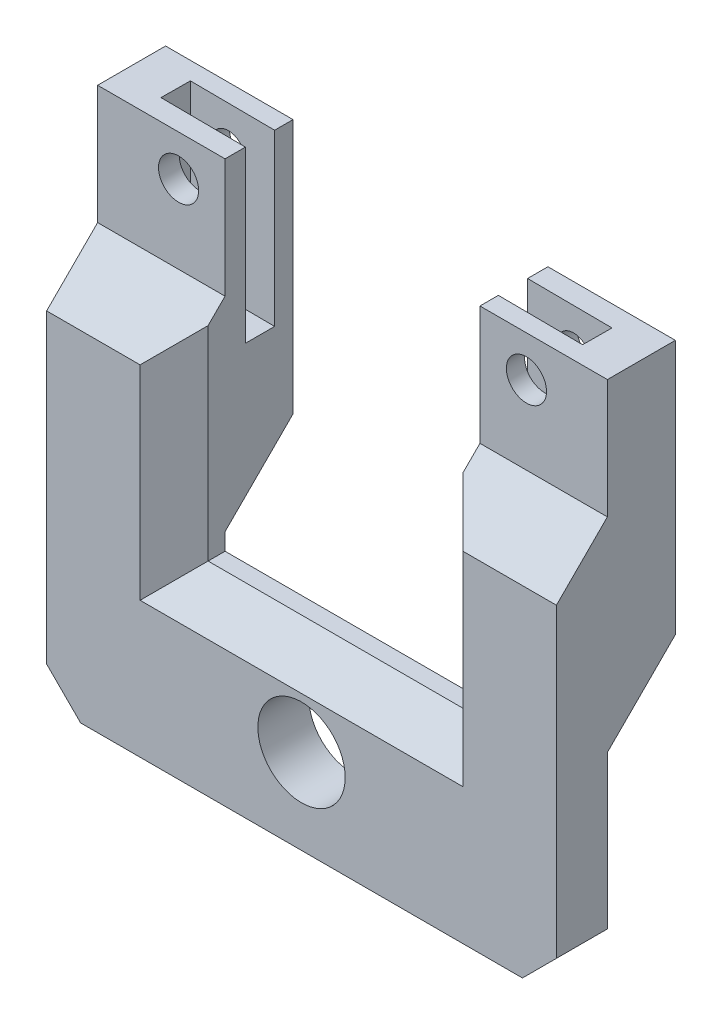
ISO-10303-21;
HEADER;
FILE_DESCRIPTION(('STEP AP214'),'2;1');
FILE_NAME('part.step','',(''),(''),'','','');
FILE_SCHEMA(('AUTOMOTIVE_DESIGN { 1 0 10303 214 1 1 1 1 }'));
ENDSEC;
DATA;
#1=APPLICATION_CONTEXT('core data for automotive mechanical design processes');
#2=APPLICATION_PROTOCOL_DEFINITION('international standard','automotive_design',2000,#1);
#3=PRODUCT_CONTEXT('',#1,'mechanical');
#4=PRODUCT('Part','Part','',(#3));
#5=PRODUCT_RELATED_PRODUCT_CATEGORY('part','',(#4));
#6=PRODUCT_DEFINITION_FORMATION('','',#4);
#7=PRODUCT_DEFINITION_CONTEXT('part definition',#1,'design');
#8=PRODUCT_DEFINITION('design','',#6,#7);
#9=PRODUCT_DEFINITION_SHAPE('','',#8);
#10=(LENGTH_UNIT() NAMED_UNIT(*) SI_UNIT(.MILLI.,.METRE.));
#11=(NAMED_UNIT(*) PLANE_ANGLE_UNIT() SI_UNIT($,.RADIAN.));
#12=(NAMED_UNIT(*) SI_UNIT($,.STERADIAN.) SOLID_ANGLE_UNIT());
#13=UNCERTAINTY_MEASURE_WITH_UNIT(LENGTH_MEASURE(1.E-05),#10,'distance_accuracy_value','');
#14=(GEOMETRIC_REPRESENTATION_CONTEXT(3) GLOBAL_UNCERTAINTY_ASSIGNED_CONTEXT((#13)) GLOBAL_UNIT_ASSIGNED_CONTEXT((#10,
#11,#12)) REPRESENTATION_CONTEXT('',''));
#15=CARTESIAN_POINT('',(0.,0.,0.));
#16=DIRECTION('',(0.,0.,1.));
#17=DIRECTION('',(1.,0.,0.));
#18=AXIS2_PLACEMENT_3D('',#15,#16,#17);
#19=CARTESIAN_POINT('',(0.,0.,-8.89));
#20=DIRECTION('',(0.,0.,1.));
#21=DIRECTION('',(1.,0.,0.));
#22=AXIS2_PLACEMENT_3D('',#19,#20,#21);
#23=PLANE('',#22);
#24=CARTESIAN_POINT('',(13.,16.002,-8.89));
#25=DIRECTION('',(0.,0.,1.));
#26=DIRECTION('',(-1.,0.,0.));
#27=AXIS2_PLACEMENT_3D('',#24,#25,#26);
#28=CIRCLE('',#27,1.27);
#29=CARTESIAN_POINT('',(11.73,16.002,-8.89));
#30=VERTEX_POINT('',#29);
#31=EDGE_CURVE('E392',#30,#30,#28,.T.);
#32=ORIENTED_EDGE('',*,*,#31,.T.);
#33=EDGE_LOOP('',(#32));
#34=FACE_BOUND('',#33,.T.);
#35=DIRECTION('',(0.,1.,0.));
#36=VECTOR('',#35,1.);
#37=CARTESIAN_POINT('',(19.05,19.05,-8.89));
#38=LINE('',#37,#36);
#39=CARTESIAN_POINT('',(19.05,0.,-8.89));
#40=VERTEX_POINT('',#39);
#41=CARTESIAN_POINT('',(19.05,19.05,-8.89));
#42=VERTEX_POINT('',#41);
#43=EDGE_CURVE('E330',#40,#42,#38,.T.);
#44=ORIENTED_EDGE('',*,*,#43,.F.);
#45=DIRECTION('',(1.,0.,0.));
#46=VECTOR('',#45,1.);
#47=CARTESIAN_POINT('',(19.05,0.,-8.89));
#48=LINE('',#47,#46);
#49=CARTESIAN_POINT('',(9.525,0.,-8.89));
#50=VERTEX_POINT('',#49);
#51=EDGE_CURVE('E232',#50,#40,#48,.T.);
#52=ORIENTED_EDGE('',*,*,#51,.F.);
#53=DIRECTION('',(0.,1.,0.));
#54=VECTOR('',#53,1.);
#55=CARTESIAN_POINT('',(9.525,-6.35,-8.89));
#56=LINE('',#55,#54);
#57=CARTESIAN_POINT('',(9.525,19.05,-8.89));
#58=VERTEX_POINT('',#57);
#59=EDGE_CURVE('E382',#50,#58,#56,.T.);
#60=ORIENTED_EDGE('',*,*,#59,.T.);
#61=DIRECTION('',(-1.,0.,0.));
#62=VECTOR('',#61,1.);
#63=CARTESIAN_POINT('',(-19.05,19.05,-8.89));
#64=LINE('',#63,#62);
#65=EDGE_CURVE('E245',#42,#58,#64,.T.);
#66=ORIENTED_EDGE('',*,*,#65,.F.);
#67=EDGE_LOOP('',(#44,#52,#60,#66));
#68=FACE_BOUND('',#67,.T.);
#69=ADVANCED_FACE('F35',(#34,#68),#23,.F.);
#70=CARTESIAN_POINT('',(-19.05,19.05,-8.89));
#71=DIRECTION('',(0.,1.,0.));
#72=DIRECTION('',(0.,0.,1.));
#73=AXIS2_PLACEMENT_3D('',#70,#71,#72);
#74=PLANE('',#73);
#75=DIRECTION('',(0.999971891836352,0.,0.00749770212982274));
#76=VECTOR('',#75,1.);
#77=CARTESIAN_POINT('',(15.8663647926359,19.05,-5.1388046784254));
#78=LINE('',#77,#76);
#79=CARTESIAN_POINT('',(9.525,19.05,-5.18635167919601));
#80=VERTEX_POINT('',#79);
#81=CARTESIAN_POINT('',(15.8663647926359,19.05,-5.1388046784254));
#82=VERTEX_POINT('',#81);
#83=EDGE_CURVE('E433',#80,#82,#78,.T.);
#84=ORIENTED_EDGE('',*,*,#83,.F.);
#85=DIRECTION('',(0.,0.,-1.));
#86=VECTOR('',#85,1.);
#87=CARTESIAN_POINT('',(9.525,19.05,-8.89));
#88=LINE('',#87,#86);
#89=CARTESIAN_POINT('',(9.525,19.05,-3.81));
#90=VERTEX_POINT('',#89);
#91=EDGE_CURVE('E389',#90,#80,#88,.T.);
#92=ORIENTED_EDGE('',*,*,#91,.F.);
#93=DIRECTION('',(-1.,0.,0.));
#94=VECTOR('',#93,1.);
#95=CARTESIAN_POINT('',(-19.05,19.05,-3.81));
#96=LINE('',#95,#94);
#97=CARTESIAN_POINT('',(19.05,19.05,-3.81));
#98=VERTEX_POINT('',#97);
#99=EDGE_CURVE('E406',#98,#90,#96,.T.);
#100=ORIENTED_EDGE('',*,*,#99,.F.);
#101=DIRECTION('',(0.,0.,1.));
#102=VECTOR('',#101,1.);
#103=CARTESIAN_POINT('',(19.05,19.05,-8.89));
#104=LINE('',#103,#102);
#105=EDGE_CURVE('E244',#42,#98,#104,.T.);
#106=ORIENTED_EDGE('',*,*,#105,.F.);
#107=ORIENTED_EDGE('',*,*,#65,.T.);
#108=CARTESIAN_POINT('',(9.525,19.05,-7.37081308039455));
#109=VERTEX_POINT('',#108);
#110=EDGE_CURVE('E388',#109,#58,#88,.T.);
#111=ORIENTED_EDGE('',*,*,#110,.F.);
#112=DIRECTION('',(-0.999971891836352,0.,-0.00749770212982277));
#113=VECTOR('',#112,1.);
#114=CARTESIAN_POINT('',(15.8827427731683,19.05,-7.32314327895272));
#115=LINE('',#114,#113);
#116=CARTESIAN_POINT('',(15.8827427731683,19.05,-7.32314327895272));
#117=VERTEX_POINT('',#116);
#118=EDGE_CURVE('E482',#117,#109,#115,.T.);
#119=ORIENTED_EDGE('',*,*,#118,.F.);
#120=DIRECTION('',(0.00749770212982325,0.,-0.999971891836352));
#121=VECTOR('',#120,1.);
#122=CARTESIAN_POINT('',(15.8827427731683,19.05,-7.32314327895272));
#123=LINE('',#122,#121);
#124=EDGE_CURVE('E459',#82,#117,#123,.T.);
#125=ORIENTED_EDGE('',*,*,#124,.F.);
#126=EDGE_LOOP('',(#84,#92,#100,#106,#107,#111,#119,#125));
#127=FACE_BOUND('',#126,.T.);
#128=ADVANCED_FACE('F430',(#127),#74,.T.);
#129=CARTESIAN_POINT('',(0.,0.,-3.81));
#130=DIRECTION('',(0.,0.,1.));
#131=DIRECTION('',(1.,0.,0.));
#132=AXIS2_PLACEMENT_3D('',#129,#130,#131);
#133=PLANE('',#132);
#134=CARTESIAN_POINT('',(13.,16.002,-3.81));
#135=DIRECTION('',(0.,0.,1.));
#136=DIRECTION('',(-1.,0.,0.));
#137=AXIS2_PLACEMENT_3D('',#134,#135,#136);
#138=CIRCLE('',#137,1.5);
#139=CARTESIAN_POINT('',(11.5,16.002,-3.81));
#140=VERTEX_POINT('',#139);
#141=EDGE_CURVE('E298',#140,#140,#138,.T.);
#142=ORIENTED_EDGE('',*,*,#141,.F.);
#143=EDGE_LOOP('',(#142));
#144=FACE_BOUND('',#143,.T.);
#145=DIRECTION('',(0.,1.,0.));
#146=VECTOR('',#145,1.);
#147=CARTESIAN_POINT('',(9.525,0.,-3.81));
#148=LINE('',#147,#146);
#149=CARTESIAN_POINT('',(9.525,10.16,-3.81));
#150=VERTEX_POINT('',#149);
#151=EDGE_CURVE('E345',#150,#90,#148,.T.);
#152=ORIENTED_EDGE('',*,*,#151,.F.);
#153=DIRECTION('',(1.,0.,0.));
#154=VECTOR('',#153,1.);
#155=CARTESIAN_POINT('',(0.,10.16,-3.81));
#156=LINE('',#155,#154);
#157=CARTESIAN_POINT('',(19.05,10.16,-3.81));
#158=VERTEX_POINT('',#157);
#159=EDGE_CURVE('E262',#150,#158,#156,.T.);
#160=ORIENTED_EDGE('',*,*,#159,.T.);
#161=DIRECTION('',(0.,1.,0.));
#162=VECTOR('',#161,1.);
#163=CARTESIAN_POINT('',(19.05,19.05,-3.81));
#164=LINE('',#163,#162);
#165=EDGE_CURVE('E402',#158,#98,#164,.T.);
#166=ORIENTED_EDGE('',*,*,#165,.T.);
#167=ORIENTED_EDGE('',*,*,#99,.T.);
#168=EDGE_LOOP('',(#152,#160,#166,#167));
#169=FACE_BOUND('',#168,.T.);
#170=ADVANCED_FACE('F426',(#144,#169),#133,.T.);
#171=CARTESIAN_POINT('',(-15.8827427731683,19.05,-5.37685672104727));
#172=VERTEX_POINT('',#171);
#173=CARTESIAN_POINT('',(-9.52500000000001,19.05,-5.32918691960544));
#174=VERTEX_POINT('',#173);
#175=EDGE_CURVE('E469',#172,#174,#78,.T.);
#176=ORIENTED_EDGE('',*,*,#175,.F.);
#177=DIRECTION('',(-0.00749770212982166,0.,0.999971891836352));
#178=VECTOR('',#177,1.);
#179=CARTESIAN_POINT('',(-15.8663647926359,19.05,-7.5611953215746));
#180=LINE('',#179,#178);
#181=CARTESIAN_POINT('',(-15.8663647926359,19.05,-7.5611953215746));
#182=VERTEX_POINT('',#181);
#183=EDGE_CURVE('E484',#182,#172,#180,.T.);
#184=ORIENTED_EDGE('',*,*,#183,.F.);
#185=CARTESIAN_POINT('',(-9.525,19.05,-7.51364832080399));
#186=VERTEX_POINT('',#185);
#187=EDGE_CURVE('E481',#186,#182,#115,.T.);
#188=ORIENTED_EDGE('',*,*,#187,.F.);
#189=DIRECTION('',(0.,0.,1.));
#190=VECTOR('',#189,1.);
#191=CARTESIAN_POINT('',(-9.525,19.05,-8.89));
#192=LINE('',#191,#190);
#193=CARTESIAN_POINT('',(-9.525,19.05,-8.89));
#194=VERTEX_POINT('',#193);
#195=EDGE_CURVE('E385',#194,#186,#192,.T.);
#196=ORIENTED_EDGE('',*,*,#195,.F.);
#197=CARTESIAN_POINT('',(-19.05,19.05,-8.89));
#198=VERTEX_POINT('',#197);
#199=EDGE_CURVE('E333',#194,#198,#64,.T.);
#200=ORIENTED_EDGE('',*,*,#199,.T.);
#201=DIRECTION('',(0.,0.,1.));
#202=VECTOR('',#201,1.);
#203=CARTESIAN_POINT('',(-19.05,19.05,-8.89));
#204=LINE('',#203,#202);
#205=CARTESIAN_POINT('',(-19.05,19.05,-3.81));
#206=VERTEX_POINT('',#205);
#207=EDGE_CURVE('E243',#198,#206,#204,.T.);
#208=ORIENTED_EDGE('',*,*,#207,.T.);
#209=CARTESIAN_POINT('',(-9.525,19.05,-3.81));
#210=VERTEX_POINT('',#209);
#211=EDGE_CURVE('E405',#210,#206,#96,.T.);
#212=ORIENTED_EDGE('',*,*,#211,.F.);
#213=EDGE_CURVE('E380',#174,#210,#192,.T.);
#214=ORIENTED_EDGE('',*,*,#213,.F.);
#215=EDGE_LOOP('',(#176,#184,#188,#196,#200,#208,#212,#214));
#216=FACE_BOUND('',#215,.T.);
#217=ADVANCED_FACE('F550',(#216),#74,.T.);
#218=CARTESIAN_POINT('',(19.05,19.05,-8.89));
#219=DIRECTION('',(1.,0.,0.));
#220=DIRECTION('',(0.,1.,0.));
#221=AXIS2_PLACEMENT_3D('',#218,#219,#220);
#222=PLANE('',#221);
#223=DIRECTION('',(0.,1.,0.));
#224=VECTOR('',#223,1.);
#225=CARTESIAN_POINT('',(19.05,19.05,0.));
#226=LINE('',#225,#224);
#227=CARTESIAN_POINT('',(19.05,-16.51,0.));
#228=VERTEX_POINT('',#227);
#229=CARTESIAN_POINT('',(19.05,6.35,0.));
#230=VERTEX_POINT('',#229);
#231=EDGE_CURVE('E335',#228,#230,#226,.T.);
#232=ORIENTED_EDGE('',*,*,#231,.F.);
#233=DIRECTION('',(0.,0.,-1.));
#234=VECTOR('',#233,1.);
#235=CARTESIAN_POINT('',(19.05,-16.51,-8.89));
#236=LINE('',#235,#234);
#237=CARTESIAN_POINT('',(19.05,-16.51,-3.81));
#238=VERTEX_POINT('',#237);
#239=EDGE_CURVE('E44',#228,#238,#236,.T.);
#240=ORIENTED_EDGE('',*,*,#239,.T.);
#241=DIRECTION('',(0.,-1.,0.));
#242=VECTOR('',#241,1.);
#243=CARTESIAN_POINT('',(19.05,-19.05,-3.81));
#244=LINE('',#243,#242);
#245=CARTESIAN_POINT('',(19.05,-5.08000000000004,-3.81));
#246=VERTEX_POINT('',#245);
#247=EDGE_CURVE('E231',#246,#238,#244,.T.);
#248=ORIENTED_EDGE('',*,*,#247,.F.);
#249=DIRECTION('',(0.,-0.707106781186551,0.707106781186544));
#250=VECTOR('',#249,1.);
#251=CARTESIAN_POINT('',(19.05,-5.08000000000003,-3.81));
#252=LINE('',#251,#250);
#253=EDGE_CURVE('E250',#246,#40,#252,.F.);
#254=ORIENTED_EDGE('',*,*,#253,.T.);
#255=ORIENTED_EDGE('',*,*,#43,.T.);
#256=ORIENTED_EDGE('',*,*,#105,.T.);
#257=ORIENTED_EDGE('',*,*,#165,.F.);
#258=DIRECTION('',(0.,-0.707106781186551,0.707106781186544));
#259=VECTOR('',#258,1.);
#260=CARTESIAN_POINT('',(19.05,10.16,-3.81));
#261=LINE('',#260,#259);
#262=EDGE_CURVE('E270',#158,#230,#261,.T.);
#263=ORIENTED_EDGE('',*,*,#262,.T.);
#264=EDGE_LOOP('',(#232,#240,#248,#254,#255,#256,#257,#263));
#265=FACE_BOUND('',#264,.T.);
#266=ADVANCED_FACE('F421',(#265),#222,.T.);
#267=CARTESIAN_POINT('',(-19.05,-19.05,-8.89));
#268=DIRECTION('',(0.,-1.,0.));
#269=DIRECTION('',(0.,0.,-1.));
#270=AXIS2_PLACEMENT_3D('',#267,#268,#269);
#271=PLANE('',#270);
#272=DIRECTION('',(1.,0.,0.));
#273=VECTOR('',#272,1.);
#274=CARTESIAN_POINT('',(-19.05,-19.05,0.));
#275=LINE('',#274,#273);
#276=CARTESIAN_POINT('',(-16.51,-19.05,0.));
#277=VERTEX_POINT('',#276);
#278=CARTESIAN_POINT('',(16.51,-19.05,0.));
#279=VERTEX_POINT('',#278);
#280=EDGE_CURVE('E326',#277,#279,#275,.T.);
#281=ORIENTED_EDGE('',*,*,#280,.F.);
#282=DIRECTION('',(0.,0.,-1.));
#283=VECTOR('',#282,1.);
#284=CARTESIAN_POINT('',(-16.51,-19.05,-8.89));
#285=LINE('',#284,#283);
#286=CARTESIAN_POINT('',(-16.51,-19.05,-1.26999999999999));
#287=VERTEX_POINT('',#286);
#288=EDGE_CURVE('E308',#277,#287,#285,.T.);
#289=ORIENTED_EDGE('',*,*,#288,.T.);
#290=DIRECTION('',(1.,0.,0.));
#291=VECTOR('',#290,1.);
#292=CARTESIAN_POINT('',(19.05,-19.05,-1.26999999999999));
#293=LINE('',#292,#291);
#294=CARTESIAN_POINT('',(16.51,-19.05,-1.26999999999999));
#295=VERTEX_POINT('',#294);
#296=EDGE_CURVE('E59',#287,#295,#293,.T.);
#297=ORIENTED_EDGE('',*,*,#296,.T.);
#298=DIRECTION('',(0.,0.,1.));
#299=VECTOR('',#298,1.);
#300=CARTESIAN_POINT('',(16.51,-19.05,-8.89));
#301=LINE('',#300,#299);
#302=EDGE_CURVE('E306',#295,#279,#301,.T.);
#303=ORIENTED_EDGE('',*,*,#302,.T.);
#304=EDGE_LOOP('',(#281,#289,#297,#303));
#305=FACE_BOUND('',#304,.T.);
#306=ADVANCED_FACE('F325',(#305),#271,.T.);
#307=CARTESIAN_POINT('',(-19.05,19.05,-8.89));
#308=DIRECTION('',(-1.,0.,0.));
#309=DIRECTION('',(0.,-1.,0.));
#310=AXIS2_PLACEMENT_3D('',#307,#308,#309);
#311=PLANE('',#310);
#312=DIRECTION('',(0.,1.,0.));
#313=VECTOR('',#312,1.);
#314=CARTESIAN_POINT('',(-19.05,-19.05,-3.81));
#315=LINE('',#314,#313);
#316=CARTESIAN_POINT('',(-19.05,-16.51,-3.81));
#317=VERTEX_POINT('',#316);
#318=CARTESIAN_POINT('',(-19.05,-5.08000000000004,-3.81));
#319=VERTEX_POINT('',#318);
#320=EDGE_CURVE('E369',#317,#319,#315,.T.);
#321=ORIENTED_EDGE('',*,*,#320,.F.);
#322=DIRECTION('',(0.,0.,1.));
#323=VECTOR('',#322,1.);
#324=CARTESIAN_POINT('',(-19.05,-16.51,-8.89));
#325=LINE('',#324,#323);
#326=CARTESIAN_POINT('',(-19.05,-16.51,0.));
#327=VERTEX_POINT('',#326);
#328=EDGE_CURVE('E292',#317,#327,#325,.T.);
#329=ORIENTED_EDGE('',*,*,#328,.T.);
#330=DIRECTION('',(0.,-1.,0.));
#331=VECTOR('',#330,1.);
#332=CARTESIAN_POINT('',(-19.05,19.05,0.));
#333=LINE('',#332,#331);
#334=CARTESIAN_POINT('',(-19.05,6.35,0.));
#335=VERTEX_POINT('',#334);
#336=EDGE_CURVE('E331',#335,#327,#333,.T.);
#337=ORIENTED_EDGE('',*,*,#336,.F.);
#338=DIRECTION('',(0.,0.707106781186551,-0.707106781186544));
#339=VECTOR('',#338,1.);
#340=CARTESIAN_POINT('',(-19.05,10.16,-3.81));
#341=LINE('',#340,#339);
#342=CARTESIAN_POINT('',(-19.05,10.16,-3.81));
#343=VERTEX_POINT('',#342);
#344=EDGE_CURVE('E268',#335,#343,#341,.T.);
#345=ORIENTED_EDGE('',*,*,#344,.T.);
#346=DIRECTION('',(0.,-1.,0.));
#347=VECTOR('',#346,1.);
#348=CARTESIAN_POINT('',(-19.05,19.05,-3.81));
#349=LINE('',#348,#347);
#350=EDGE_CURVE('E399',#206,#343,#349,.T.);
#351=ORIENTED_EDGE('',*,*,#350,.F.);
#352=ORIENTED_EDGE('',*,*,#207,.F.);
#353=DIRECTION('',(0.,-1.,0.));
#354=VECTOR('',#353,1.);
#355=CARTESIAN_POINT('',(-19.05,19.05,-8.89));
#356=LINE('',#355,#354);
#357=CARTESIAN_POINT('',(-19.05,0.,-8.89));
#358=VERTEX_POINT('',#357);
#359=EDGE_CURVE('E227',#198,#358,#356,.T.);
#360=ORIENTED_EDGE('',*,*,#359,.T.);
#361=DIRECTION('',(0.,0.707106781186551,-0.707106781186544));
#362=VECTOR('',#361,1.);
#363=CARTESIAN_POINT('',(-19.05,-5.08000000000003,-3.81));
#364=LINE('',#363,#362);
#365=EDGE_CURVE('E239',#358,#319,#364,.F.);
#366=ORIENTED_EDGE('',*,*,#365,.T.);
#367=EDGE_LOOP('',(#321,#329,#337,#345,#351,#352,#360,#366));
#368=FACE_BOUND('',#367,.T.);
#369=ADVANCED_FACE('F238',(#368),#311,.T.);
#370=CARTESIAN_POINT('',(-13.,16.002,-8.89));
#371=DIRECTION('',(0.,0.,1.));
#372=DIRECTION('',(1.,0.,0.));
#373=AXIS2_PLACEMENT_3D('',#370,#371,#372);
#374=CIRCLE('',#373,1.27);
#375=CARTESIAN_POINT('',(-11.73,16.002,-8.89));
#376=VERTEX_POINT('',#375);
#377=EDGE_CURVE('E395',#376,#376,#374,.T.);
#378=ORIENTED_EDGE('',*,*,#377,.T.);
#379=EDGE_LOOP('',(#378));
#380=FACE_BOUND('',#379,.T.);
#381=DIRECTION('',(0.,-1.,0.));
#382=VECTOR('',#381,1.);
#383=CARTESIAN_POINT('',(-9.525,-6.35,-8.89));
#384=LINE('',#383,#382);
#385=CARTESIAN_POINT('',(-9.52500000000001,0.,-8.89));
#386=VERTEX_POINT('',#385);
#387=EDGE_CURVE('E228',#194,#386,#384,.T.);
#388=ORIENTED_EDGE('',*,*,#387,.T.);
#389=EDGE_CURVE('E223',#358,#386,#48,.T.);
#390=ORIENTED_EDGE('',*,*,#389,.F.);
#391=ORIENTED_EDGE('',*,*,#359,.F.);
#392=ORIENTED_EDGE('',*,*,#199,.F.);
#393=EDGE_LOOP('',(#388,#390,#391,#392));
#394=FACE_BOUND('',#393,.T.);
#395=ADVANCED_FACE('F225',(#380,#394),#23,.F.);
#396=CARTESIAN_POINT('',(0.,0.,0.));
#397=DIRECTION('',(0.,0.,1.));
#398=DIRECTION('',(1.,0.,0.));
#399=AXIS2_PLACEMENT_3D('',#396,#397,#398);
#400=PLANE('',#399);
#401=CARTESIAN_POINT('',(0.,-12.7,0.));
#402=DIRECTION('',(0.,0.,1.));
#403=DIRECTION('',(1.,0.,0.));
#404=AXIS2_PLACEMENT_3D('',#401,#402,#403);
#405=CIRCLE('',#404,3.2639);
#406=CARTESIAN_POINT('',(3.2639,-12.7,0.));
#407=VERTEX_POINT('',#406);
#408=EDGE_CURVE('E363',#407,#407,#405,.T.);
#409=ORIENTED_EDGE('',*,*,#408,.F.);
#410=EDGE_LOOP('',(#409));
#411=FACE_BOUND('',#410,.T.);
#412=ORIENTED_EDGE('',*,*,#336,.T.);
#413=DIRECTION('',(-0.707106781186549,0.707106781186546,0.));
#414=VECTOR('',#413,1.);
#415=CARTESIAN_POINT('',(-17.78,-17.78,0.));
#416=LINE('',#415,#414);
#417=EDGE_CURVE('E303',#327,#277,#416,.F.);
#418=ORIENTED_EDGE('',*,*,#417,.T.);
#419=ORIENTED_EDGE('',*,*,#280,.T.);
#420=DIRECTION('',(-0.707106781186549,-0.707106781186546,0.));
#421=VECTOR('',#420,1.);
#422=CARTESIAN_POINT('',(17.78,-17.78,0.));
#423=LINE('',#422,#421);
#424=EDGE_CURVE('E301',#279,#228,#423,.F.);
#425=ORIENTED_EDGE('',*,*,#424,.T.);
#426=ORIENTED_EDGE('',*,*,#231,.T.);
#427=DIRECTION('',(1.,0.,0.));
#428=VECTOR('',#427,1.);
#429=CARTESIAN_POINT('',(-19.05,6.35,0.));
#430=LINE('',#429,#428);
#431=CARTESIAN_POINT('',(12.065,6.35,0.));
#432=VERTEX_POINT('',#431);
#433=EDGE_CURVE('E398',#432,#230,#430,.T.);
#434=ORIENTED_EDGE('',*,*,#433,.F.);
#435=DIRECTION('',(0.,-1.,0.));
#436=VECTOR('',#435,1.);
#437=CARTESIAN_POINT('',(12.065,-6.35,0.));
#438=LINE('',#437,#436);
#439=CARTESIAN_POINT('',(12.065,-8.89000000000001,0.));
#440=VERTEX_POINT('',#439);
#441=EDGE_CURVE('E278',#432,#440,#438,.T.);
#442=ORIENTED_EDGE('',*,*,#441,.T.);
#443=DIRECTION('',(-1.,0.,0.));
#444=VECTOR('',#443,1.);
#445=CARTESIAN_POINT('',(-9.525,-8.89000000000001,0.));
#446=LINE('',#445,#444);
#447=CARTESIAN_POINT('',(-12.065,-8.89000000000001,0.));
#448=VERTEX_POINT('',#447);
#449=EDGE_CURVE('E280',#440,#448,#446,.T.);
#450=ORIENTED_EDGE('',*,*,#449,.T.);
#451=DIRECTION('',(0.,1.,0.));
#452=VECTOR('',#451,1.);
#453=CARTESIAN_POINT('',(-12.065,6.35,0.));
#454=LINE('',#453,#452);
#455=CARTESIAN_POINT('',(-12.065,6.35,0.));
#456=VERTEX_POINT('',#455);
#457=EDGE_CURVE('E282',#448,#456,#454,.T.);
#458=ORIENTED_EDGE('',*,*,#457,.T.);
#459=EDGE_CURVE('E403',#335,#456,#430,.T.);
#460=ORIENTED_EDGE('',*,*,#459,.F.);
#461=EDGE_LOOP('',(#412,#418,#419,#425,#426,#434,#442,#450,#458,#460));
#462=FACE_BOUND('',#461,.T.);
#463=ADVANCED_FACE('F329',(#411,#462),#400,.T.);
#464=CARTESIAN_POINT('',(-13.,16.002,-3.81));
#465=DIRECTION('',(0.,0.,1.));
#466=DIRECTION('',(1.,0.,0.));
#467=AXIS2_PLACEMENT_3D('',#464,#465,#466);
#468=CIRCLE('',#467,1.5);
#469=CARTESIAN_POINT('',(-11.5,16.002,-3.81));
#470=VERTEX_POINT('',#469);
#471=EDGE_CURVE('E603',#470,#470,#468,.T.);
#472=ORIENTED_EDGE('',*,*,#471,.F.);
#473=EDGE_LOOP('',(#472));
#474=FACE_BOUND('',#473,.T.);
#475=ORIENTED_EDGE('',*,*,#350,.T.);
#476=DIRECTION('',(1.,0.,0.));
#477=VECTOR('',#476,1.);
#478=CARTESIAN_POINT('',(0.,10.16,-3.81));
#479=LINE('',#478,#477);
#480=CARTESIAN_POINT('',(-9.525,10.16,-3.81));
#481=VERTEX_POINT('',#480);
#482=EDGE_CURVE('E259',#343,#481,#479,.T.);
#483=ORIENTED_EDGE('',*,*,#482,.T.);
#484=DIRECTION('',(0.,-1.,0.));
#485=VECTOR('',#484,1.);
#486=CARTESIAN_POINT('',(-9.525,0.,-3.81));
#487=LINE('',#486,#485);
#488=EDGE_CURVE('E340',#210,#481,#487,.T.);
#489=ORIENTED_EDGE('',*,*,#488,.F.);
#490=ORIENTED_EDGE('',*,*,#211,.T.);
#491=EDGE_LOOP('',(#475,#483,#489,#490));
#492=FACE_BOUND('',#491,.T.);
#493=ADVANCED_FACE('F559',(#474,#492),#133,.T.);
#494=CARTESIAN_POINT('',(-13.,16.002,-8.89));
#495=DIRECTION('',(0.,0.,1.));
#496=DIRECTION('',(1.,0.,0.));
#497=AXIS2_PLACEMENT_3D('',#494,#495,#496);
#498=CYLINDRICAL_SURFACE('',#497,1.27);
#499=CARTESIAN_POINT('',(-13.,16.002,-7.53970356807028));
#500=DIRECTION('',(0.00749770212982277,0.,-0.999971891836352));
#501=DIRECTION('',(0.999971891836352,0.,0.00749770212982277));
#502=AXIS2_PLACEMENT_3D('',#499,#500,#501);
#503=ELLIPSE('',#502,1.27003569837125,1.27);
#504=CARTESIAN_POINT('',(-11.73,16.002,-7.53018121870965));
#505=VERTEX_POINT('',#504);
#506=EDGE_CURVE('E505',#505,#505,#503,.F.);
#507=ORIENTED_EDGE('',*,*,#506,.T.);
#508=EDGE_LOOP('',(#507));
#509=FACE_BOUND('',#508,.T.);
#510=ORIENTED_EDGE('',*,*,#377,.F.);
#511=EDGE_LOOP('',(#510));
#512=FACE_BOUND('',#511,.T.);
#513=ADVANCED_FACE('F564',(#509,#512),#498,.F.);
#514=CARTESIAN_POINT('',(13.,16.002,-8.89));
#515=DIRECTION('',(0.,0.,1.));
#516=DIRECTION('',(1.,0.,0.));
#517=AXIS2_PLACEMENT_3D('',#514,#515,#516);
#518=CYLINDRICAL_SURFACE('',#517,1.27);
#519=CARTESIAN_POINT('',(13.,16.002,-7.34475783312827));
#520=DIRECTION('',(0.00749770212982277,0.,-0.999971891836352));
#521=DIRECTION('',(0.999971891836352,0.,0.00749770212982277));
#522=AXIS2_PLACEMENT_3D('',#519,#520,#521);
#523=ELLIPSE('',#522,1.27003569837125,1.27);
#524=CARTESIAN_POINT('',(14.27,16.002,-7.33523548376764));
#525=VERTEX_POINT('',#524);
#526=EDGE_CURVE('E502',#525,#525,#523,.F.);
#527=ORIENTED_EDGE('',*,*,#526,.T.);
#528=EDGE_LOOP('',(#527));
#529=FACE_BOUND('',#528,.T.);
#530=ORIENTED_EDGE('',*,*,#31,.F.);
#531=EDGE_LOOP('',(#530));
#532=FACE_BOUND('',#531,.T.);
#533=ADVANCED_FACE('F566',(#529,#532),#518,.F.);
#534=CARTESIAN_POINT('',(9.525,-6.35,-8.89));
#535=DIRECTION('',(1.,0.,0.));
#536=DIRECTION('',(0.,0.,-1.));
#537=AXIS2_PLACEMENT_3D('',#534,#535,#536);
#538=PLANE('',#537);
#539=DIRECTION('',(0.,0.,1.));
#540=VECTOR('',#539,1.);
#541=CARTESIAN_POINT('',(9.525,-6.35,-8.89));
#542=LINE('',#541,#540);
#543=CARTESIAN_POINT('',(9.52499999999999,-6.35,-3.81));
#544=VERTEX_POINT('',#543);
#545=CARTESIAN_POINT('',(9.525,-6.35,-2.54));
#546=VERTEX_POINT('',#545);
#547=EDGE_CURVE('E377',#544,#546,#542,.T.);
#548=ORIENTED_EDGE('',*,*,#547,.T.);
#549=DIRECTION('',(0.,1.,0.));
#550=VECTOR('',#549,1.);
#551=CARTESIAN_POINT('',(9.525,6.35,-2.54));
#552=LINE('',#551,#550);
#553=CARTESIAN_POINT('',(9.525,8.89000000000002,-2.54));
#554=VERTEX_POINT('',#553);
#555=EDGE_CURVE('E288',#546,#554,#552,.T.);
#556=ORIENTED_EDGE('',*,*,#555,.T.);
#557=DIRECTION('',(0.,0.707106781186551,-0.707106781186544));
#558=VECTOR('',#557,1.);
#559=CARTESIAN_POINT('',(9.525,4.44499999999992,1.90500000000005));
#560=LINE('',#559,#558);
#561=EDGE_CURVE('E273',#554,#150,#560,.T.);
#562=ORIENTED_EDGE('',*,*,#561,.T.);
#563=ORIENTED_EDGE('',*,*,#151,.T.);
#564=ORIENTED_EDGE('',*,*,#91,.T.);
#565=DIRECTION('',(0.,-1.,0.));
#566=VECTOR('',#565,1.);
#567=CARTESIAN_POINT('',(9.525,-6.35,-5.18635167919601));
#568=LINE('',#567,#566);
#569=CARTESIAN_POINT('',(9.525,6.35,-5.18635167919601));
#570=VERTEX_POINT('',#569);
#571=EDGE_CURVE('E438',#80,#570,#568,.T.);
#572=ORIENTED_EDGE('',*,*,#571,.T.);
#573=DIRECTION('',(0.,0.,-1.));
#574=VECTOR('',#573,1.);
#575=CARTESIAN_POINT('',(9.525,6.35,-8.89));
#576=LINE('',#575,#574);
#577=CARTESIAN_POINT('',(9.525,6.35,-7.37081308039455));
#578=VERTEX_POINT('',#577);
#579=EDGE_CURVE('E491',#570,#578,#576,.T.);
#580=ORIENTED_EDGE('',*,*,#579,.T.);
#581=DIRECTION('',(0.,1.,0.));
#582=VECTOR('',#581,1.);
#583=CARTESIAN_POINT('',(9.525,-6.35,-7.37081308039455));
#584=LINE('',#583,#582);
#585=EDGE_CURVE('E499',#578,#109,#584,.T.);
#586=ORIENTED_EDGE('',*,*,#585,.T.);
#587=ORIENTED_EDGE('',*,*,#110,.T.);
#588=ORIENTED_EDGE('',*,*,#59,.F.);
#589=DIRECTION('',(0.,0.707106781186551,-0.707106781186544));
#590=VECTOR('',#589,1.);
#591=CARTESIAN_POINT('',(9.525,-3.17500000000002,-5.71499999999999));
#592=LINE('',#591,#590);
#593=CARTESIAN_POINT('',(9.525,-5.08000000000003,-3.81));
#594=VERTEX_POINT('',#593);
#595=EDGE_CURVE('E253',#50,#594,#592,.F.);
#596=ORIENTED_EDGE('',*,*,#595,.T.);
#597=DIRECTION('',(0.,-1.,0.));
#598=VECTOR('',#597,1.);
#599=CARTESIAN_POINT('',(9.525,-6.35,-3.81));
#600=LINE('',#599,#598);
#601=EDGE_CURVE('E455',#594,#544,#600,.T.);
#602=ORIENTED_EDGE('',*,*,#601,.T.);
#603=EDGE_LOOP('',(#548,#556,#562,#563,#564,#572,#580,#586,#587,#588,#596,#602));
#604=FACE_BOUND('',#603,.T.);
#605=ADVANCED_FACE('F436',(#604),#538,.F.);
#606=CARTESIAN_POINT('',(-9.525,-6.35,-8.89));
#607=DIRECTION('',(0.,-1.,0.));
#608=DIRECTION('',(0.,0.,-1.));
#609=AXIS2_PLACEMENT_3D('',#606,#607,#608);
#610=PLANE('',#609);
#611=DIRECTION('',(0.,0.,1.));
#612=VECTOR('',#611,1.);
#613=CARTESIAN_POINT('',(-9.525,-6.35,-8.89));
#614=LINE('',#613,#612);
#615=CARTESIAN_POINT('',(-9.525,-6.35,-3.81));
#616=VERTEX_POINT('',#615);
#617=CARTESIAN_POINT('',(-9.525,-6.35,-2.54));
#618=VERTEX_POINT('',#617);
#619=EDGE_CURVE('E374',#616,#618,#614,.T.);
#620=ORIENTED_EDGE('',*,*,#619,.T.);
#621=DIRECTION('',(1.,0.,0.));
#622=VECTOR('',#621,1.);
#623=CARTESIAN_POINT('',(9.525,-6.35,-2.54));
#624=LINE('',#623,#622);
#625=EDGE_CURVE('E286',#618,#546,#624,.T.);
#626=ORIENTED_EDGE('',*,*,#625,.T.);
#627=ORIENTED_EDGE('',*,*,#547,.F.);
#628=DIRECTION('',(-1.,0.,0.));
#629=VECTOR('',#628,1.);
#630=CARTESIAN_POINT('',(-9.525,-6.35,-3.81));
#631=LINE('',#630,#629);
#632=EDGE_CURVE('E460',#544,#616,#631,.T.);
#633=ORIENTED_EDGE('',*,*,#632,.T.);
#634=EDGE_LOOP('',(#620,#626,#627,#633));
#635=FACE_BOUND('',#634,.T.);
#636=ADVANCED_FACE('F453',(#635),#610,.F.);
#637=CARTESIAN_POINT('',(-9.525,-6.35,-8.89));
#638=DIRECTION('',(-1.,0.,0.));
#639=DIRECTION('',(0.,0.,1.));
#640=AXIS2_PLACEMENT_3D('',#637,#638,#639);
#641=PLANE('',#640);
#642=DIRECTION('',(0.,-0.707106781186551,0.707106781186544));
#643=VECTOR('',#642,1.);
#644=CARTESIAN_POINT('',(-9.525,4.44499999999992,1.90500000000005));
#645=LINE('',#644,#643);
#646=CARTESIAN_POINT('',(-9.525,8.89000000000002,-2.54));
#647=VERTEX_POINT('',#646);
#648=EDGE_CURVE('E265',#481,#647,#645,.T.);
#649=ORIENTED_EDGE('',*,*,#648,.T.);
#650=DIRECTION('',(0.,-1.,0.));
#651=VECTOR('',#650,1.);
#652=CARTESIAN_POINT('',(-9.525,-6.35,-2.54));
#653=LINE('',#652,#651);
#654=EDGE_CURVE('E275',#647,#618,#653,.T.);
#655=ORIENTED_EDGE('',*,*,#654,.T.);
#656=ORIENTED_EDGE('',*,*,#619,.F.);
#657=DIRECTION('',(0.,1.,0.));
#658=VECTOR('',#657,1.);
#659=CARTESIAN_POINT('',(-9.525,-6.35,-3.81));
#660=LINE('',#659,#658);
#661=CARTESIAN_POINT('',(-9.525,-5.08000000000003,-3.81));
#662=VERTEX_POINT('',#661);
#663=EDGE_CURVE('E356',#616,#662,#660,.T.);
#664=ORIENTED_EDGE('',*,*,#663,.T.);
#665=DIRECTION('',(0.,-0.707106781186551,0.707106781186544));
#666=VECTOR('',#665,1.);
#667=CARTESIAN_POINT('',(-9.525,-3.17500000000002,-5.71499999999999));
#668=LINE('',#667,#666);
#669=EDGE_CURVE('E251',#662,#386,#668,.F.);
#670=ORIENTED_EDGE('',*,*,#669,.T.);
#671=ORIENTED_EDGE('',*,*,#387,.F.);
#672=ORIENTED_EDGE('',*,*,#195,.T.);
#673=DIRECTION('',(0.,-1.,0.));
#674=VECTOR('',#673,1.);
#675=CARTESIAN_POINT('',(-9.525,-6.35,-7.51364832080399));
#676=LINE('',#675,#674);
#677=CARTESIAN_POINT('',(-9.525,6.35,-7.51364832080399));
#678=VERTEX_POINT('',#677);
#679=EDGE_CURVE('E350',#186,#678,#676,.T.);
#680=ORIENTED_EDGE('',*,*,#679,.T.);
#681=DIRECTION('',(0.,0.,1.));
#682=VECTOR('',#681,1.);
#683=CARTESIAN_POINT('',(-9.525,6.35,-8.89));
#684=LINE('',#683,#682);
#685=CARTESIAN_POINT('',(-9.52500000000001,6.35,-5.32918691960544));
#686=VERTEX_POINT('',#685);
#687=EDGE_CURVE('E347',#678,#686,#684,.T.);
#688=ORIENTED_EDGE('',*,*,#687,.T.);
#689=DIRECTION('',(0.,1.,0.));
#690=VECTOR('',#689,1.);
#691=CARTESIAN_POINT('',(-9.525,-6.35,-5.32918691960544));
#692=LINE('',#691,#690);
#693=EDGE_CURVE('E353',#686,#174,#692,.T.);
#694=ORIENTED_EDGE('',*,*,#693,.T.);
#695=ORIENTED_EDGE('',*,*,#213,.T.);
#696=ORIENTED_EDGE('',*,*,#488,.T.);
#697=EDGE_LOOP('',(#649,#655,#656,#664,#670,#671,#672,#680,#688,#694,#695,#696));
#698=FACE_BOUND('',#697,.T.);
#699=ADVANCED_FACE('F372',(#698),#641,.F.);
#700=CARTESIAN_POINT('',(0.,6.35,0.));
#701=DIRECTION('',(0.,-1.,0.));
#702=DIRECTION('',(0.,0.,-1.));
#703=AXIS2_PLACEMENT_3D('',#700,#701,#702);
#704=PLANE('',#703);
#705=DIRECTION('',(-0.999971891836352,0.,-0.00749770212982277));
#706=VECTOR('',#705,1.);
#707=CARTESIAN_POINT('',(15.8827427731683,6.35,-7.32314327895272));
#708=LINE('',#707,#706);
#709=CARTESIAN_POINT('',(-15.8663647926359,6.35,-7.5611953215746));
#710=VERTEX_POINT('',#709);
#711=EDGE_CURVE('E468',#678,#710,#708,.T.);
#712=ORIENTED_EDGE('',*,*,#711,.T.);
#713=DIRECTION('',(-0.00749770212982166,0.,0.999971891836352));
#714=VECTOR('',#713,1.);
#715=CARTESIAN_POINT('',(-15.8663647926359,6.35,-7.5611953215746));
#716=LINE('',#715,#714);
#717=CARTESIAN_POINT('',(-15.8827427731683,6.35,-5.37685672104727));
#718=VERTEX_POINT('',#717);
#719=EDGE_CURVE('E472',#710,#718,#716,.T.);
#720=ORIENTED_EDGE('',*,*,#719,.T.);
#721=DIRECTION('',(0.999971891836352,0.,0.00749770212982274));
#722=VECTOR('',#721,1.);
#723=CARTESIAN_POINT('',(15.8663647926359,6.35,-5.1388046784254));
#724=LINE('',#723,#722);
#725=EDGE_CURVE('E476',#718,#686,#724,.T.);
#726=ORIENTED_EDGE('',*,*,#725,.T.);
#727=ORIENTED_EDGE('',*,*,#687,.F.);
#728=EDGE_LOOP('',(#712,#720,#726,#727));
#729=FACE_BOUND('',#728,.T.);
#730=ADVANCED_FACE('F531',(#729),#704,.F.);
#731=CARTESIAN_POINT('',(15.8827427731683,6.35,-7.32314327895272));
#732=DIRECTION('',(0.00749770212982277,0.,-0.999971891836352));
#733=DIRECTION('',(-0.999971891836352,0.,-0.00749770212982277));
#734=AXIS2_PLACEMENT_3D('',#731,#732,#733);
#735=PLANE('',#734);
#736=ORIENTED_EDGE('',*,*,#187,.T.);
#737=DIRECTION('',(0.,1.,0.));
#738=VECTOR('',#737,1.);
#739=CARTESIAN_POINT('',(-15.8663647926359,6.35,-7.5611953215746));
#740=LINE('',#739,#738);
#741=EDGE_CURVE('E494',#710,#182,#740,.T.);
#742=ORIENTED_EDGE('',*,*,#741,.F.);
#743=ORIENTED_EDGE('',*,*,#711,.F.);
#744=ORIENTED_EDGE('',*,*,#679,.F.);
#745=EDGE_LOOP('',(#736,#742,#743,#744));
#746=FACE_BOUND('',#745,.T.);
#747=ORIENTED_EDGE('',*,*,#506,.F.);
#748=EDGE_LOOP('',(#747));
#749=FACE_BOUND('',#748,.T.);
#750=ADVANCED_FACE('F538',(#746,#749),#735,.F.);
#751=CARTESIAN_POINT('',(15.8663647926359,6.35,-5.1388046784254));
#752=DIRECTION('',(-0.00749770212982274,0.,0.999971891836352));
#753=DIRECTION('',(0.999971891836352,0.,0.00749770212982274));
#754=AXIS2_PLACEMENT_3D('',#751,#752,#753);
#755=PLANE('',#754);
#756=CARTESIAN_POINT('',(-13.,16.002,-5.35524216687173));
#757=DIRECTION('',(-0.00749770212982274,0.,0.999971891836352));
#758=DIRECTION('',(0.999971891836352,0.,0.00749770212982274));
#759=AXIS2_PLACEMENT_3D('',#756,#757,#758);
#760=ELLIPSE('',#759,1.50004216343061,1.5);
#761=CARTESIAN_POINT('',(-11.5,16.002,-5.34399529754815));
#762=VERTEX_POINT('',#761);
#763=EDGE_CURVE('E606',#762,#762,#760,.F.);
#764=ORIENTED_EDGE('',*,*,#763,.F.);
#765=EDGE_LOOP('',(#764));
#766=FACE_BOUND('',#765,.T.);
#767=ORIENTED_EDGE('',*,*,#725,.F.);
#768=DIRECTION('',(0.,1.,0.));
#769=VECTOR('',#768,1.);
#770=CARTESIAN_POINT('',(-15.8827427731683,6.35,-5.37685672104727));
#771=LINE('',#770,#769);
#772=EDGE_CURVE('E492',#718,#172,#771,.T.);
#773=ORIENTED_EDGE('',*,*,#772,.T.);
#774=ORIENTED_EDGE('',*,*,#175,.T.);
#775=ORIENTED_EDGE('',*,*,#693,.F.);
#776=EDGE_LOOP('',(#767,#773,#774,#775));
#777=FACE_BOUND('',#776,.T.);
#778=ADVANCED_FACE('F584',(#766,#777),#755,.F.);
#779=CARTESIAN_POINT('',(-15.8663647926359,6.35,-7.5611953215746));
#780=DIRECTION('',(-0.999971891836352,0.,-0.00749770212982166));
#781=DIRECTION('',(-0.00749770212982166,0.,0.999971891836352));
#782=AXIS2_PLACEMENT_3D('',#779,#780,#781);
#783=PLANE('',#782);
#784=ORIENTED_EDGE('',*,*,#183,.T.);
#785=ORIENTED_EDGE('',*,*,#772,.F.);
#786=ORIENTED_EDGE('',*,*,#719,.F.);
#787=ORIENTED_EDGE('',*,*,#741,.T.);
#788=EDGE_LOOP('',(#784,#785,#786,#787));
#789=FACE_BOUND('',#788,.T.);
#790=ADVANCED_FACE('F586',(#789),#783,.F.);
#791=CARTESIAN_POINT('',(13.,16.002,-5.16029643192972));
#792=DIRECTION('',(-0.00749770212982274,0.,0.999971891836352));
#793=DIRECTION('',(0.999971891836352,0.,0.00749770212982274));
#794=AXIS2_PLACEMENT_3D('',#791,#792,#793);
#795=ELLIPSE('',#794,1.50004216343061,1.5);
#796=CARTESIAN_POINT('',(14.5,16.002,-5.14904956260614));
#797=VERTEX_POINT('',#796);
#798=EDGE_CURVE('E601',#797,#797,#795,.F.);
#799=ORIENTED_EDGE('',*,*,#798,.F.);
#800=EDGE_LOOP('',(#799));
#801=FACE_BOUND('',#800,.T.);
#802=ORIENTED_EDGE('',*,*,#83,.T.);
#803=DIRECTION('',(0.,1.,0.));
#804=VECTOR('',#803,1.);
#805=CARTESIAN_POINT('',(15.8663647926359,6.35,-5.1388046784254));
#806=LINE('',#805,#804);
#807=CARTESIAN_POINT('',(15.8663647926359,6.35,-5.1388046784254));
#808=VERTEX_POINT('',#807);
#809=EDGE_CURVE('E488',#808,#82,#806,.T.);
#810=ORIENTED_EDGE('',*,*,#809,.F.);
#811=EDGE_CURVE('E475',#570,#808,#724,.T.);
#812=ORIENTED_EDGE('',*,*,#811,.F.);
#813=ORIENTED_EDGE('',*,*,#571,.F.);
#814=EDGE_LOOP('',(#802,#810,#812,#813));
#815=FACE_BOUND('',#814,.T.);
#816=ADVANCED_FACE('F526',(#801,#815),#755,.F.);
#817=CARTESIAN_POINT('',(15.8827427731683,6.35,-7.32314327895272));
#818=VERTEX_POINT('',#817);
#819=EDGE_CURVE('E470',#818,#578,#708,.T.);
#820=ORIENTED_EDGE('',*,*,#819,.F.);
#821=DIRECTION('',(0.,1.,0.));
#822=VECTOR('',#821,1.);
#823=CARTESIAN_POINT('',(15.8827427731683,6.35,-7.32314327895272));
#824=LINE('',#823,#822);
#825=EDGE_CURVE('E478',#818,#117,#824,.T.);
#826=ORIENTED_EDGE('',*,*,#825,.T.);
#827=ORIENTED_EDGE('',*,*,#118,.T.);
#828=ORIENTED_EDGE('',*,*,#585,.F.);
#829=EDGE_LOOP('',(#820,#826,#827,#828));
#830=FACE_BOUND('',#829,.T.);
#831=ORIENTED_EDGE('',*,*,#526,.F.);
#832=EDGE_LOOP('',(#831));
#833=FACE_BOUND('',#832,.T.);
#834=ADVANCED_FACE('F518',(#830,#833),#735,.F.);
#835=ORIENTED_EDGE('',*,*,#811,.T.);
#836=DIRECTION('',(0.00749770212982325,0.,-0.999971891836352));
#837=VECTOR('',#836,1.);
#838=CARTESIAN_POINT('',(15.8827427731683,6.35,-7.32314327895272));
#839=LINE('',#838,#837);
#840=EDGE_CURVE('E465',#808,#818,#839,.T.);
#841=ORIENTED_EDGE('',*,*,#840,.T.);
#842=ORIENTED_EDGE('',*,*,#819,.T.);
#843=ORIENTED_EDGE('',*,*,#579,.F.);
#844=EDGE_LOOP('',(#835,#841,#842,#843));
#845=FACE_BOUND('',#844,.T.);
#846=ADVANCED_FACE('F528',(#845),#704,.F.);
#847=CARTESIAN_POINT('',(15.8827427731683,6.35,-7.32314327895272));
#848=DIRECTION('',(0.999971891836352,0.,0.00749770212982325));
#849=DIRECTION('',(0.00749770212982325,0.,-0.999971891836352));
#850=AXIS2_PLACEMENT_3D('',#847,#848,#849);
#851=PLANE('',#850);
#852=ORIENTED_EDGE('',*,*,#124,.T.);
#853=ORIENTED_EDGE('',*,*,#825,.F.);
#854=ORIENTED_EDGE('',*,*,#840,.F.);
#855=ORIENTED_EDGE('',*,*,#809,.T.);
#856=EDGE_LOOP('',(#852,#853,#854,#855));
#857=FACE_BOUND('',#856,.T.);
#858=ADVANCED_FACE('F522',(#857),#851,.F.);
#859=CARTESIAN_POINT('',(0.,0.,-3.81));
#860=DIRECTION('',(0.,0.,1.));
#861=DIRECTION('',(1.,0.,0.));
#862=AXIS2_PLACEMENT_3D('',#859,#860,#861);
#863=PLANE('',#862);
#864=CARTESIAN_POINT('',(0.,-12.7,-3.81));
#865=DIRECTION('',(0.,0.,1.));
#866=DIRECTION('',(1.,0.,0.));
#867=AXIS2_PLACEMENT_3D('',#864,#865,#866);
#868=CIRCLE('',#867,3.2639);
#869=CARTESIAN_POINT('',(3.2639,-12.7,-3.81));
#870=VERTEX_POINT('',#869);
#871=EDGE_CURVE('E360',#870,#870,#868,.T.);
#872=ORIENTED_EDGE('',*,*,#871,.T.);
#873=EDGE_LOOP('',(#872));
#874=FACE_BOUND('',#873,.T.);
#875=ORIENTED_EDGE('',*,*,#247,.T.);
#876=DIRECTION('',(-1.,0.,0.));
#877=VECTOR('',#876,1.);
#878=CARTESIAN_POINT('',(-19.05,-16.51,-3.81));
#879=LINE('',#878,#877);
#880=EDGE_CURVE('E11',#238,#317,#879,.T.);
#881=ORIENTED_EDGE('',*,*,#880,.T.);
#882=ORIENTED_EDGE('',*,*,#320,.T.);
#883=DIRECTION('',(1.,0.,0.));
#884=VECTOR('',#883,1.);
#885=CARTESIAN_POINT('',(-9.525,-5.08000000000003,-3.81));
#886=LINE('',#885,#884);
#887=EDGE_CURVE('E249',#319,#662,#886,.T.);
#888=ORIENTED_EDGE('',*,*,#887,.T.);
#889=ORIENTED_EDGE('',*,*,#663,.F.);
#890=ORIENTED_EDGE('',*,*,#632,.F.);
#891=ORIENTED_EDGE('',*,*,#601,.F.);
#892=DIRECTION('',(1.,0.,0.));
#893=VECTOR('',#892,1.);
#894=CARTESIAN_POINT('',(19.05,-5.08000000000003,-3.81));
#895=LINE('',#894,#893);
#896=EDGE_CURVE('E359',#594,#246,#895,.T.);
#897=ORIENTED_EDGE('',*,*,#896,.T.);
#898=EDGE_LOOP('',(#875,#881,#882,#888,#889,#890,#891,#897));
#899=FACE_BOUND('',#898,.T.);
#900=ADVANCED_FACE('F366',(#874,#899),#863,.F.);
#901=CARTESIAN_POINT('',(0.,-12.7,-8.89));
#902=DIRECTION('',(0.,0.,1.));
#903=DIRECTION('',(1.,0.,0.));
#904=AXIS2_PLACEMENT_3D('',#901,#902,#903);
#905=CYLINDRICAL_SURFACE('',#904,3.2639);
#906=ORIENTED_EDGE('',*,*,#408,.T.);
#907=EDGE_LOOP('',(#906));
#908=FACE_BOUND('',#907,.T.);
#909=ORIENTED_EDGE('',*,*,#871,.F.);
#910=EDGE_LOOP('',(#909));
#911=FACE_BOUND('',#910,.T.);
#912=ADVANCED_FACE('F746',(#908,#911),#905,.F.);
#913=CARTESIAN_POINT('',(-13.,16.002,-8.891));
#914=DIRECTION('',(0.,0.,1.));
#915=DIRECTION('',(1.,0.,0.));
#916=AXIS2_PLACEMENT_3D('',#913,#914,#915);
#917=CYLINDRICAL_SURFACE('',#916,1.5);
#918=ORIENTED_EDGE('',*,*,#471,.T.);
#919=EDGE_LOOP('',(#918));
#920=FACE_BOUND('',#919,.T.);
#921=ORIENTED_EDGE('',*,*,#763,.T.);
#922=EDGE_LOOP('',(#921));
#923=FACE_BOUND('',#922,.T.);
#924=ADVANCED_FACE('F737',(#920,#923),#917,.F.);
#925=CARTESIAN_POINT('',(13.,16.002,-8.891));
#926=DIRECTION('',(0.,0.,1.));
#927=DIRECTION('',(1.,0.,0.));
#928=AXIS2_PLACEMENT_3D('',#925,#926,#927);
#929=CYLINDRICAL_SURFACE('',#928,1.5);
#930=ORIENTED_EDGE('',*,*,#141,.T.);
#931=EDGE_LOOP('',(#930));
#932=FACE_BOUND('',#931,.T.);
#933=ORIENTED_EDGE('',*,*,#798,.T.);
#934=EDGE_LOOP('',(#933));
#935=FACE_BOUND('',#934,.T.);
#936=ADVANCED_FACE('F626',(#932,#935),#929,.F.);
#937=CARTESIAN_POINT('',(0.,-5.08000000000003,-3.81));
#938=DIRECTION('',(0.,-0.707106781186544,-0.707106781186551));
#939=DIRECTION('',(-1.,0.,0.));
#940=AXIS2_PLACEMENT_3D('',#937,#938,#939);
#941=PLANE('',#940);
#942=ORIENTED_EDGE('',*,*,#365,.F.);
#943=ORIENTED_EDGE('',*,*,#389,.T.);
#944=ORIENTED_EDGE('',*,*,#669,.F.);
#945=ORIENTED_EDGE('',*,*,#887,.F.);
#946=EDGE_LOOP('',(#942,#943,#944,#945));
#947=FACE_BOUND('',#946,.T.);
#948=ADVANCED_FACE('F247',(#947),#941,.T.);
#949=CARTESIAN_POINT('',(0.,-5.08000000000003,-3.81));
#950=DIRECTION('',(0.,-0.707106781186544,-0.707106781186551));
#951=DIRECTION('',(-1.,0.,0.));
#952=AXIS2_PLACEMENT_3D('',#949,#950,#951);
#953=PLANE('',#952);
#954=ORIENTED_EDGE('',*,*,#595,.F.);
#955=ORIENTED_EDGE('',*,*,#51,.T.);
#956=ORIENTED_EDGE('',*,*,#253,.F.);
#957=ORIENTED_EDGE('',*,*,#896,.F.);
#958=EDGE_LOOP('',(#954,#955,#956,#957));
#959=FACE_BOUND('',#958,.T.);
#960=ADVANCED_FACE('F616',(#959),#953,.T.);
#961=CARTESIAN_POINT('',(0.,10.16,-3.81));
#962=DIRECTION('',(0.,-0.707106781186544,-0.707106781186551));
#963=DIRECTION('',(1.,0.,0.));
#964=AXIS2_PLACEMENT_3D('',#961,#962,#963);
#965=PLANE('',#964);
#966=ORIENTED_EDGE('',*,*,#459,.T.);
#967=DIRECTION('',(0.577350269189625,0.57735026918963,-0.577350269189623));
#968=VECTOR('',#967,1.);
#969=CARTESIAN_POINT('',(-14.605,3.80999999999994,2.54000000000002));
#970=LINE('',#969,#968);
#971=EDGE_CURVE('E284',#456,#647,#970,.T.);
#972=ORIENTED_EDGE('',*,*,#971,.T.);
#973=ORIENTED_EDGE('',*,*,#648,.F.);
#974=ORIENTED_EDGE('',*,*,#482,.F.);
#975=ORIENTED_EDGE('',*,*,#344,.F.);
#976=EDGE_LOOP('',(#966,#972,#973,#974,#975));
#977=FACE_BOUND('',#976,.T.);
#978=ADVANCED_FACE('F618',(#977),#965,.F.);
#979=CARTESIAN_POINT('',(0.,10.16,-3.81));
#980=DIRECTION('',(0.,-0.707106781186544,-0.707106781186551));
#981=DIRECTION('',(1.,0.,0.));
#982=AXIS2_PLACEMENT_3D('',#979,#980,#981);
#983=PLANE('',#982);
#984=ORIENTED_EDGE('',*,*,#561,.F.);
#985=DIRECTION('',(0.577350269189625,-0.57735026918963,0.577350269189623));
#986=VECTOR('',#985,1.);
#987=CARTESIAN_POINT('',(14.605,3.80999999999994,2.54000000000002));
#988=LINE('',#987,#986);
#989=EDGE_CURVE('E290',#554,#432,#988,.T.);
#990=ORIENTED_EDGE('',*,*,#989,.T.);
#991=ORIENTED_EDGE('',*,*,#433,.T.);
#992=ORIENTED_EDGE('',*,*,#262,.F.);
#993=ORIENTED_EDGE('',*,*,#159,.F.);
#994=EDGE_LOOP('',(#984,#990,#991,#992,#993));
#995=FACE_BOUND('',#994,.T.);
#996=ADVANCED_FACE('F417',(#995),#983,.F.);
#997=CARTESIAN_POINT('',(9.525,-6.35,-2.54));
#998=DIRECTION('',(-0.707106781186547,0.,0.707106781186548));
#999=DIRECTION('',(0.,-1.,0.));
#1000=AXIS2_PLACEMENT_3D('',#997,#998,#999);
#1001=PLANE('',#1000);
#1002=ORIENTED_EDGE('',*,*,#989,.F.);
#1003=ORIENTED_EDGE('',*,*,#555,.F.);
#1004=DIRECTION('',(0.577350269189626,-0.577350269189626,0.577350269189625));
#1005=VECTOR('',#1004,1.);
#1006=CARTESIAN_POINT('',(3.17499999999999,0.,-8.89));
#1007=LINE('',#1006,#1005);
#1008=EDGE_CURVE('E295',#440,#546,#1007,.F.);
#1009=ORIENTED_EDGE('',*,*,#1008,.F.);
#1010=ORIENTED_EDGE('',*,*,#441,.F.);
#1011=EDGE_LOOP('',(#1002,#1003,#1009,#1010));
#1012=FACE_BOUND('',#1011,.T.);
#1013=ADVANCED_FACE('F441',(#1012),#1001,.T.);
#1014=CARTESIAN_POINT('',(-9.525,-6.35,-2.54));
#1015=DIRECTION('',(0.,0.707106781186547,0.707106781186548));
#1016=DIRECTION('',(-1.,0.,0.));
#1017=AXIS2_PLACEMENT_3D('',#1014,#1015,#1016);
#1018=PLANE('',#1017);
#1019=ORIENTED_EDGE('',*,*,#1008,.T.);
#1020=ORIENTED_EDGE('',*,*,#625,.F.);
#1021=DIRECTION('',(-0.577350269189626,-0.577350269189626,0.577350269189625));
#1022=VECTOR('',#1021,1.);
#1023=CARTESIAN_POINT('',(-9.525,-6.35,-2.54));
#1024=LINE('',#1023,#1022);
#1025=EDGE_CURVE('E293',#448,#618,#1024,.F.);
#1026=ORIENTED_EDGE('',*,*,#1025,.F.);
#1027=ORIENTED_EDGE('',*,*,#449,.F.);
#1028=EDGE_LOOP('',(#1019,#1020,#1026,#1027));
#1029=FACE_BOUND('',#1028,.T.);
#1030=ADVANCED_FACE('F451',(#1029),#1018,.T.);
#1031=CARTESIAN_POINT('',(-9.525,-6.35,-2.54));
#1032=DIRECTION('',(0.707106781186547,0.,0.707106781186548));
#1033=DIRECTION('',(0.,1.,0.));
#1034=AXIS2_PLACEMENT_3D('',#1031,#1032,#1033);
#1035=PLANE('',#1034);
#1036=ORIENTED_EDGE('',*,*,#971,.F.);
#1037=ORIENTED_EDGE('',*,*,#457,.F.);
#1038=ORIENTED_EDGE('',*,*,#1025,.T.);
#1039=ORIENTED_EDGE('',*,*,#654,.F.);
#1040=EDGE_LOOP('',(#1036,#1037,#1038,#1039));
#1041=FACE_BOUND('',#1040,.T.);
#1042=ADVANCED_FACE('F449',(#1041),#1035,.T.);
#1043=CARTESIAN_POINT('',(16.51,-19.05,-8.89));
#1044=DIRECTION('',(-0.707106781186546,0.707106781186549,0.));
#1045=DIRECTION('',(0.,0.,1.));
#1046=AXIS2_PLACEMENT_3D('',#1043,#1044,#1045);
#1047=PLANE('',#1046);
#1048=ORIENTED_EDGE('',*,*,#424,.F.);
#1049=ORIENTED_EDGE('',*,*,#302,.F.);
#1050=DIRECTION('',(0.577350269189626,0.577350269189624,-0.577350269189627));
#1051=VECTOR('',#1050,1.);
#1052=CARTESIAN_POINT('',(12.7,-22.86,2.54000000000002));
#1053=LINE('',#1052,#1051);
#1054=EDGE_CURVE('E39',#238,#295,#1053,.F.);
#1055=ORIENTED_EDGE('',*,*,#1054,.F.);
#1056=ORIENTED_EDGE('',*,*,#239,.F.);
#1057=EDGE_LOOP('',(#1048,#1049,#1055,#1056));
#1058=FACE_BOUND('',#1057,.T.);
#1059=ADVANCED_FACE('F37',(#1058),#1047,.F.);
#1060=CARTESIAN_POINT('',(0.,-16.51,-3.81));
#1061=DIRECTION('',(0.,-0.707106781186549,-0.707106781186546));
#1062=DIRECTION('',(1.,0.,0.));
#1063=AXIS2_PLACEMENT_3D('',#1060,#1061,#1062);
#1064=PLANE('',#1063);
#1065=ORIENTED_EDGE('',*,*,#1054,.T.);
#1066=ORIENTED_EDGE('',*,*,#296,.F.);
#1067=DIRECTION('',(0.577350269189626,-0.577350269189624,0.577350269189627));
#1068=VECTOR('',#1067,1.);
#1069=CARTESIAN_POINT('',(-12.7,-22.86,2.54000000000002));
#1070=LINE('',#1069,#1068);
#1071=EDGE_CURVE('E310',#317,#287,#1070,.T.);
#1072=ORIENTED_EDGE('',*,*,#1071,.F.);
#1073=ORIENTED_EDGE('',*,*,#880,.F.);
#1074=EDGE_LOOP('',(#1065,#1066,#1072,#1073));
#1075=FACE_BOUND('',#1074,.T.);
#1076=ADVANCED_FACE('F320',(#1075),#1064,.T.);
#1077=CARTESIAN_POINT('',(-19.05,-16.51,-8.89));
#1078=DIRECTION('',(0.707106781186546,0.707106781186549,0.));
#1079=DIRECTION('',(0.,0.,1.));
#1080=AXIS2_PLACEMENT_3D('',#1077,#1078,#1079);
#1081=PLANE('',#1080);
#1082=ORIENTED_EDGE('',*,*,#1071,.T.);
#1083=ORIENTED_EDGE('',*,*,#288,.F.);
#1084=ORIENTED_EDGE('',*,*,#417,.F.);
#1085=ORIENTED_EDGE('',*,*,#328,.F.);
#1086=EDGE_LOOP('',(#1082,#1083,#1084,#1085));
#1087=FACE_BOUND('',#1086,.T.);
#1088=ADVANCED_FACE('F638',(#1087),#1081,.F.);
#1089=CLOSED_SHELL('',(#69,#128,#170,#217,#266,#306,#369,#395,#463,#493,#513,#533,#605,#636,
#699,#730,#750,#778,#790,#816,#834,#846,#858,#900,#912,#924,#936,#948,#960,#978,#996,#1013,
#1030,#1042,#1059,#1076,#1088));
#1090=MANIFOLD_SOLID_BREP('B2',#1089);
#1091=ADVANCED_BREP_SHAPE_REPRESENTATION('',(#18,#1090),#14);
#1092=SHAPE_DEFINITION_REPRESENTATION(#9,#1091);
ENDSEC;
END-ISO-10303-21;
